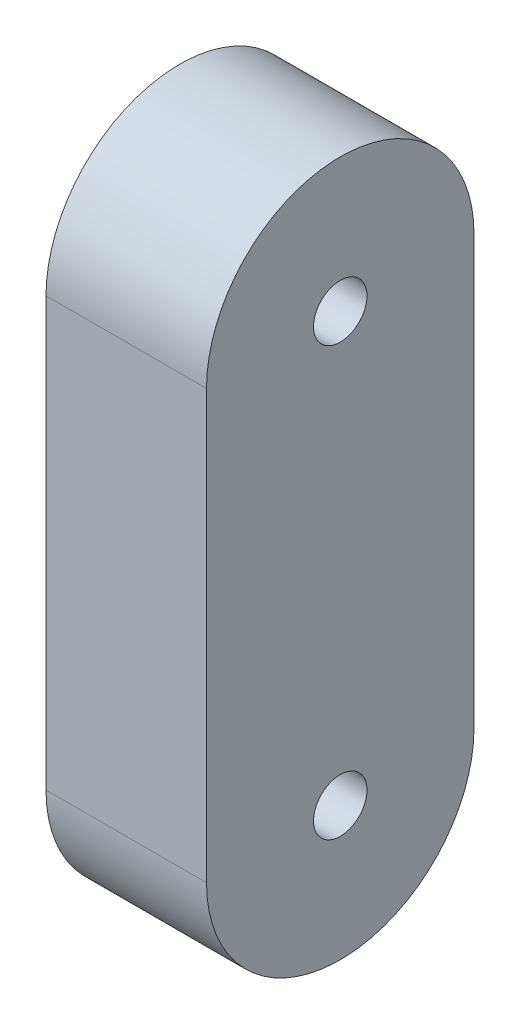
ISO-10303-21;
HEADER;
FILE_DESCRIPTION(('STEP AP214'),'2;1');
FILE_NAME('part.step','',(''),(''),'','','');
FILE_SCHEMA(('AUTOMOTIVE_DESIGN { 1 0 10303 214 1 1 1 1 }'));
ENDSEC;
DATA;
#1=APPLICATION_CONTEXT('core data for automotive mechanical design processes');
#2=APPLICATION_PROTOCOL_DEFINITION('international standard','automotive_design',2000,#1);
#3=PRODUCT_CONTEXT('',#1,'mechanical');
#4=PRODUCT('Part','Part','',(#3));
#5=PRODUCT_RELATED_PRODUCT_CATEGORY('part','',(#4));
#6=PRODUCT_DEFINITION_FORMATION('','',#4);
#7=PRODUCT_DEFINITION_CONTEXT('part definition',#1,'design');
#8=PRODUCT_DEFINITION('design','',#6,#7);
#9=PRODUCT_DEFINITION_SHAPE('','',#8);
#10=(LENGTH_UNIT() NAMED_UNIT(*) SI_UNIT(.MILLI.,.METRE.));
#11=(NAMED_UNIT(*) PLANE_ANGLE_UNIT() SI_UNIT($,.RADIAN.));
#12=(NAMED_UNIT(*) SI_UNIT($,.STERADIAN.) SOLID_ANGLE_UNIT());
#13=UNCERTAINTY_MEASURE_WITH_UNIT(LENGTH_MEASURE(1.E-05),#10,'distance_accuracy_value','');
#14=(GEOMETRIC_REPRESENTATION_CONTEXT(3) GLOBAL_UNCERTAINTY_ASSIGNED_CONTEXT((#13)) GLOBAL_UNIT_ASSIGNED_CONTEXT((#10,
#11,#12)) REPRESENTATION_CONTEXT('',''));
#15=CARTESIAN_POINT('',(0.,0.,0.));
#16=DIRECTION('',(0.,0.,1.));
#17=DIRECTION('',(1.,0.,0.));
#18=AXIS2_PLACEMENT_3D('',#15,#16,#17);
#19=CARTESIAN_POINT('',(30.,-40.,0.));
#20=DIRECTION('',(-1.,0.,0.));
#21=DIRECTION('',(0.,0.,1.));
#22=AXIS2_PLACEMENT_3D('',#19,#20,#21);
#23=CYLINDRICAL_SURFACE('',#22,25.);
#24=CARTESIAN_POINT('',(0.,-40.,0.));
#25=DIRECTION('',(1.,0.,0.));
#26=DIRECTION('',(0.,0.,-1.));
#27=AXIS2_PLACEMENT_3D('',#24,#25,#26);
#28=CIRCLE('',#27,25.);
#29=CARTESIAN_POINT('',(0.,-40.,25.));
#30=VERTEX_POINT('',#29);
#31=CARTESIAN_POINT('',(0.,-40.,-25.));
#32=VERTEX_POINT('',#31);
#33=EDGE_CURVE('E99',#30,#32,#28,.T.);
#34=ORIENTED_EDGE('',*,*,#33,.T.);
#35=DIRECTION('',(-1.,0.,0.));
#36=VECTOR('',#35,1.);
#37=CARTESIAN_POINT('',(30.,-40.,-25.));
#38=LINE('',#37,#36);
#39=CARTESIAN_POINT('',(30.,-40.,-25.));
#40=VERTEX_POINT('',#39);
#41=EDGE_CURVE('E11',#40,#32,#38,.T.);
#42=ORIENTED_EDGE('',*,*,#41,.F.);
#43=CARTESIAN_POINT('',(30.,-40.,0.));
#44=DIRECTION('',(1.,0.,0.));
#45=DIRECTION('',(0.,0.,-1.));
#46=AXIS2_PLACEMENT_3D('',#43,#44,#45);
#47=CIRCLE('',#46,25.);
#48=CARTESIAN_POINT('',(30.,-40.,25.));
#49=VERTEX_POINT('',#48);
#50=EDGE_CURVE('E87',#49,#40,#47,.T.);
#51=ORIENTED_EDGE('',*,*,#50,.F.);
#52=DIRECTION('',(-1.,0.,0.));
#53=VECTOR('',#52,1.);
#54=CARTESIAN_POINT('',(30.,-40.,25.));
#55=LINE('',#54,#53);
#56=EDGE_CURVE('E95',#49,#30,#55,.T.);
#57=ORIENTED_EDGE('',*,*,#56,.T.);
#58=EDGE_LOOP('',(#34,#42,#51,#57));
#59=FACE_BOUND('',#58,.T.);
#60=ADVANCED_FACE('F36',(#59),#23,.T.);
#61=CARTESIAN_POINT('',(30.,40.,-25.));
#62=DIRECTION('',(0.,0.,1.));
#63=DIRECTION('',(0.,-1.,0.));
#64=AXIS2_PLACEMENT_3D('',#61,#62,#63);
#65=PLANE('',#64);
#66=DIRECTION('',(0.,1.,0.));
#67=VECTOR('',#66,1.);
#68=CARTESIAN_POINT('',(0.,40.,-25.));
#69=LINE('',#68,#67);
#70=CARTESIAN_POINT('',(0.,40.,-25.));
#71=VERTEX_POINT('',#70);
#72=EDGE_CURVE('E91',#32,#71,#69,.T.);
#73=ORIENTED_EDGE('',*,*,#72,.T.);
#74=DIRECTION('',(-1.,0.,0.));
#75=VECTOR('',#74,1.);
#76=CARTESIAN_POINT('',(30.,40.,-25.));
#77=LINE('',#76,#75);
#78=CARTESIAN_POINT('',(30.,40.,-25.));
#79=VERTEX_POINT('',#78);
#80=EDGE_CURVE('E44',#79,#71,#77,.T.);
#81=ORIENTED_EDGE('',*,*,#80,.F.);
#82=DIRECTION('',(0.,1.,0.));
#83=VECTOR('',#82,1.);
#84=CARTESIAN_POINT('',(30.,40.,-25.));
#85=LINE('',#84,#83);
#86=EDGE_CURVE('E82',#40,#79,#85,.T.);
#87=ORIENTED_EDGE('',*,*,#86,.F.);
#88=ORIENTED_EDGE('',*,*,#41,.T.);
#89=EDGE_LOOP('',(#73,#81,#87,#88));
#90=FACE_BOUND('',#89,.T.);
#91=ADVANCED_FACE('F90',(#90),#65,.F.);
#92=CARTESIAN_POINT('',(30.,40.,0.));
#93=DIRECTION('',(-1.,0.,0.));
#94=DIRECTION('',(0.,0.,1.));
#95=AXIS2_PLACEMENT_3D('',#92,#93,#94);
#96=CYLINDRICAL_SURFACE('',#95,25.);
#97=CARTESIAN_POINT('',(0.,40.,0.));
#98=DIRECTION('',(1.,0.,0.));
#99=DIRECTION('',(0.,0.,1.));
#100=AXIS2_PLACEMENT_3D('',#97,#98,#99);
#101=CIRCLE('',#100,25.);
#102=CARTESIAN_POINT('',(0.,40.,25.));
#103=VERTEX_POINT('',#102);
#104=EDGE_CURVE('E69',#71,#103,#101,.T.);
#105=ORIENTED_EDGE('',*,*,#104,.T.);
#106=DIRECTION('',(-1.,0.,0.));
#107=VECTOR('',#106,1.);
#108=CARTESIAN_POINT('',(30.,40.,25.));
#109=LINE('',#108,#107);
#110=CARTESIAN_POINT('',(30.,40.,25.));
#111=VERTEX_POINT('',#110);
#112=EDGE_CURVE('E92',#111,#103,#109,.T.);
#113=ORIENTED_EDGE('',*,*,#112,.F.);
#114=CARTESIAN_POINT('',(30.,40.,0.));
#115=DIRECTION('',(1.,0.,0.));
#116=DIRECTION('',(0.,0.,1.));
#117=AXIS2_PLACEMENT_3D('',#114,#115,#116);
#118=CIRCLE('',#117,25.);
#119=EDGE_CURVE('E85',#79,#111,#118,.T.);
#120=ORIENTED_EDGE('',*,*,#119,.F.);
#121=ORIENTED_EDGE('',*,*,#80,.T.);
#122=EDGE_LOOP('',(#105,#113,#120,#121));
#123=FACE_BOUND('',#122,.T.);
#124=ADVANCED_FACE('F93',(#123),#96,.T.);
#125=CARTESIAN_POINT('',(30.,40.,25.));
#126=DIRECTION('',(0.,0.,-1.));
#127=DIRECTION('',(0.,1.,0.));
#128=AXIS2_PLACEMENT_3D('',#125,#126,#127);
#129=PLANE('',#128);
#130=DIRECTION('',(0.,-1.,0.));
#131=VECTOR('',#130,1.);
#132=CARTESIAN_POINT('',(0.,40.,25.));
#133=LINE('',#132,#131);
#134=EDGE_CURVE('E75',#103,#30,#133,.T.);
#135=ORIENTED_EDGE('',*,*,#134,.T.);
#136=ORIENTED_EDGE('',*,*,#56,.F.);
#137=DIRECTION('',(0.,-1.,0.));
#138=VECTOR('',#137,1.);
#139=CARTESIAN_POINT('',(30.,40.,25.));
#140=LINE('',#139,#138);
#141=EDGE_CURVE('E52',#111,#49,#140,.T.);
#142=ORIENTED_EDGE('',*,*,#141,.F.);
#143=ORIENTED_EDGE('',*,*,#112,.T.);
#144=EDGE_LOOP('',(#135,#136,#142,#143));
#145=FACE_BOUND('',#144,.T.);
#146=ADVANCED_FACE('F107',(#145),#129,.F.);
#147=CARTESIAN_POINT('',(30.,-40.,0.));
#148=DIRECTION('',(1.,0.,0.));
#149=DIRECTION('',(0.,0.,-1.));
#150=AXIS2_PLACEMENT_3D('',#147,#148,#149);
#151=PLANE('',#150);
#152=CARTESIAN_POINT('',(30.,40.,0.));
#153=DIRECTION('',(1.,0.,0.));
#154=DIRECTION('',(0.,0.,-1.));
#155=AXIS2_PLACEMENT_3D('',#152,#153,#154);
#156=CIRCLE('',#155,5.);
#157=CARTESIAN_POINT('',(30.,40.,-4.99999999999999));
#158=VERTEX_POINT('',#157);
#159=EDGE_CURVE('E119',#158,#158,#156,.T.);
#160=ORIENTED_EDGE('',*,*,#159,.F.);
#161=EDGE_LOOP('',(#160));
#162=FACE_BOUND('',#161,.T.);
#163=CARTESIAN_POINT('',(30.,-40.,0.));
#164=DIRECTION('',(1.,0.,0.));
#165=DIRECTION('',(0.,0.,-1.));
#166=AXIS2_PLACEMENT_3D('',#163,#164,#165);
#167=CIRCLE('',#166,5.);
#168=CARTESIAN_POINT('',(30.,-40.,-5.));
#169=VERTEX_POINT('',#168);
#170=EDGE_CURVE('E113',#169,#169,#167,.T.);
#171=ORIENTED_EDGE('',*,*,#170,.F.);
#172=EDGE_LOOP('',(#171));
#173=FACE_BOUND('',#172,.T.);
#174=ORIENTED_EDGE('',*,*,#50,.T.);
#175=ORIENTED_EDGE('',*,*,#86,.T.);
#176=ORIENTED_EDGE('',*,*,#119,.T.);
#177=ORIENTED_EDGE('',*,*,#141,.T.);
#178=EDGE_LOOP('',(#174,#175,#176,#177));
#179=FACE_BOUND('',#178,.T.);
#180=ADVANCED_FACE('F83',(#162,#173,#179),#151,.T.);
#181=CARTESIAN_POINT('',(0.,-40.,0.));
#182=DIRECTION('',(1.,0.,0.));
#183=DIRECTION('',(0.,0.,-1.));
#184=AXIS2_PLACEMENT_3D('',#181,#182,#183);
#185=PLANE('',#184);
#186=CARTESIAN_POINT('',(0.,40.,0.));
#187=DIRECTION('',(1.,0.,0.));
#188=DIRECTION('',(0.,0.,-1.));
#189=AXIS2_PLACEMENT_3D('',#186,#187,#188);
#190=CIRCLE('',#189,5.);
#191=CARTESIAN_POINT('',(0.,40.,-4.99999999999999));
#192=VERTEX_POINT('',#191);
#193=EDGE_CURVE('E102',#192,#192,#190,.T.);
#194=ORIENTED_EDGE('',*,*,#193,.T.);
#195=EDGE_LOOP('',(#194));
#196=FACE_BOUND('',#195,.T.);
#197=CARTESIAN_POINT('',(0.,-40.,0.));
#198=DIRECTION('',(1.,0.,0.));
#199=DIRECTION('',(0.,0.,-1.));
#200=AXIS2_PLACEMENT_3D('',#197,#198,#199);
#201=CIRCLE('',#200,5.);
#202=CARTESIAN_POINT('',(0.,-40.,-5.));
#203=VERTEX_POINT('',#202);
#204=EDGE_CURVE('E116',#203,#203,#201,.T.);
#205=ORIENTED_EDGE('',*,*,#204,.T.);
#206=EDGE_LOOP('',(#205));
#207=FACE_BOUND('',#206,.T.);
#208=ORIENTED_EDGE('',*,*,#33,.F.);
#209=ORIENTED_EDGE('',*,*,#134,.F.);
#210=ORIENTED_EDGE('',*,*,#104,.F.);
#211=ORIENTED_EDGE('',*,*,#72,.F.);
#212=EDGE_LOOP('',(#208,#209,#210,#211));
#213=FACE_BOUND('',#212,.T.);
#214=ADVANCED_FACE('F110',(#196,#207,#213),#185,.F.);
#215=CARTESIAN_POINT('',(0.,-40.,0.));
#216=DIRECTION('',(1.,0.,0.));
#217=DIRECTION('',(0.,0.,-1.));
#218=AXIS2_PLACEMENT_3D('',#215,#216,#217);
#219=CYLINDRICAL_SURFACE('',#218,5.);
#220=ORIENTED_EDGE('',*,*,#204,.F.);
#221=EDGE_LOOP('',(#220));
#222=FACE_BOUND('',#221,.T.);
#223=ORIENTED_EDGE('',*,*,#170,.T.);
#224=EDGE_LOOP('',(#223));
#225=FACE_BOUND('',#224,.T.);
#226=ADVANCED_FACE('F130',(#222,#225),#219,.F.);
#227=CARTESIAN_POINT('',(0.,40.,0.));
#228=DIRECTION('',(1.,0.,0.));
#229=DIRECTION('',(0.,0.,-1.));
#230=AXIS2_PLACEMENT_3D('',#227,#228,#229);
#231=CYLINDRICAL_SURFACE('',#230,5.);
#232=ORIENTED_EDGE('',*,*,#193,.F.);
#233=EDGE_LOOP('',(#232));
#234=FACE_BOUND('',#233,.T.);
#235=ORIENTED_EDGE('',*,*,#159,.T.);
#236=EDGE_LOOP('',(#235));
#237=FACE_BOUND('',#236,.T.);
#238=ADVANCED_FACE('F127',(#234,#237),#231,.F.);
#239=CLOSED_SHELL('',(#60,#91,#124,#146,#180,#214,#226,#238));
#240=MANIFOLD_SOLID_BREP('B2',#239);
#241=ADVANCED_BREP_SHAPE_REPRESENTATION('',(#18,#240),#14);
#242=SHAPE_DEFINITION_REPRESENTATION(#9,#241);
ENDSEC;
END-ISO-10303-21;
